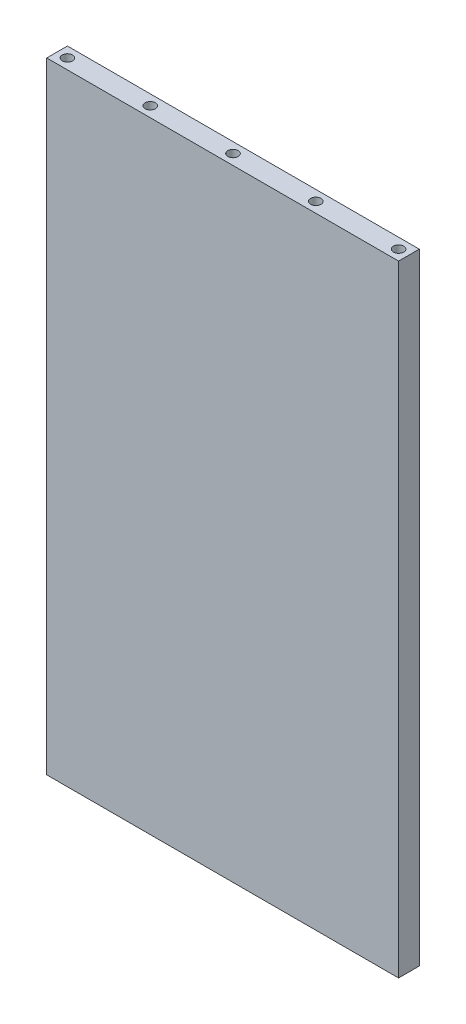
ISO-10303-21;
HEADER;
FILE_DESCRIPTION(('STEP AP214'),'2;1');
FILE_NAME('part.step','',(''),(''),'','','');
FILE_SCHEMA(('AUTOMOTIVE_DESIGN { 1 0 10303 214 1 1 1 1 }'));
ENDSEC;
DATA;
#1=APPLICATION_CONTEXT('core data for automotive mechanical design processes');
#2=APPLICATION_PROTOCOL_DEFINITION('international standard','automotive_design',2000,#1);
#3=PRODUCT_CONTEXT('',#1,'mechanical');
#4=PRODUCT('Part','Part','',(#3));
#5=PRODUCT_RELATED_PRODUCT_CATEGORY('part','',(#4));
#6=PRODUCT_DEFINITION_FORMATION('','',#4);
#7=PRODUCT_DEFINITION_CONTEXT('part definition',#1,'design');
#8=PRODUCT_DEFINITION('design','',#6,#7);
#9=PRODUCT_DEFINITION_SHAPE('','',#8);
#10=(LENGTH_UNIT() NAMED_UNIT(*) SI_UNIT(.MILLI.,.METRE.));
#11=(NAMED_UNIT(*) PLANE_ANGLE_UNIT() SI_UNIT($,.RADIAN.));
#12=(NAMED_UNIT(*) SI_UNIT($,.STERADIAN.) SOLID_ANGLE_UNIT());
#13=UNCERTAINTY_MEASURE_WITH_UNIT(LENGTH_MEASURE(1.E-05),#10,'distance_accuracy_value','');
#14=(GEOMETRIC_REPRESENTATION_CONTEXT(3) GLOBAL_UNCERTAINTY_ASSIGNED_CONTEXT((#13)) GLOBAL_UNIT_ASSIGNED_CONTEXT((#10,
#11,#12)) REPRESENTATION_CONTEXT('',''));
#15=CARTESIAN_POINT('',(0.,0.,0.));
#16=DIRECTION('',(0.,0.,1.));
#17=DIRECTION('',(1.,0.,0.));
#18=AXIS2_PLACEMENT_3D('',#15,#16,#17);
#19=CARTESIAN_POINT('',(-85.,150.,5.));
#20=DIRECTION('',(0.,-1.,0.));
#21=DIRECTION('',(0.,0.,-1.));
#22=AXIS2_PLACEMENT_3D('',#19,#20,#21);
#23=PLANE('',#22);
#24=CARTESIAN_POINT('',(-40.,150.,-8.37955521322352E-13));
#25=DIRECTION('',(0.,-1.,0.));
#26=DIRECTION('',(0.,0.,-1.));
#27=AXIS2_PLACEMENT_3D('',#24,#25,#26);
#28=CIRCLE('',#27,2.5);
#29=CARTESIAN_POINT('',(-40.,150.,-2.50000000000083));
#30=VERTEX_POINT('',#29);
#31=EDGE_CURVE('E161',#30,#30,#28,.T.);
#32=ORIENTED_EDGE('',*,*,#31,.T.);
#33=EDGE_LOOP('',(#32));
#34=FACE_BOUND('',#33,.T.);
#35=CARTESIAN_POINT('',(40.,150.,-2.79318507107451E-13));
#36=DIRECTION('',(0.,-1.,0.));
#37=DIRECTION('',(0.,0.,-1.));
#38=AXIS2_PLACEMENT_3D('',#35,#36,#37);
#39=CIRCLE('',#38,2.5);
#40=CARTESIAN_POINT('',(40.,150.,-2.50000000000027));
#41=VERTEX_POINT('',#40);
#42=EDGE_CURVE('E149',#41,#41,#39,.T.);
#43=ORIENTED_EDGE('',*,*,#42,.T.);
#44=EDGE_LOOP('',(#43));
#45=FACE_BOUND('',#44,.T.);
#46=DIRECTION('',(-1.,0.,0.));
#47=VECTOR('',#46,1.);
#48=CARTESIAN_POINT('',(-85.,150.,-5.));
#49=LINE('',#48,#47);
#50=CARTESIAN_POINT('',(85.,150.,-5.));
#51=VERTEX_POINT('',#50);
#52=CARTESIAN_POINT('',(-85.,150.,-5.));
#53=VERTEX_POINT('',#52);
#54=EDGE_CURVE('E91',#51,#53,#49,.T.);
#55=ORIENTED_EDGE('',*,*,#54,.T.);
#56=DIRECTION('',(0.,0.,-1.));
#57=VECTOR('',#56,1.);
#58=CARTESIAN_POINT('',(-85.,150.,5.));
#59=LINE('',#58,#57);
#60=CARTESIAN_POINT('',(-85.,150.,5.));
#61=VERTEX_POINT('',#60);
#62=EDGE_CURVE('E44',#61,#53,#59,.T.);
#63=ORIENTED_EDGE('',*,*,#62,.F.);
#64=DIRECTION('',(-1.,0.,0.));
#65=VECTOR('',#64,1.);
#66=CARTESIAN_POINT('',(-85.,150.,5.));
#67=LINE('',#66,#65);
#68=CARTESIAN_POINT('',(85.,150.,5.));
#69=VERTEX_POINT('',#68);
#70=EDGE_CURVE('E82',#69,#61,#67,.T.);
#71=ORIENTED_EDGE('',*,*,#70,.F.);
#72=DIRECTION('',(0.,0.,-1.));
#73=VECTOR('',#72,1.);
#74=CARTESIAN_POINT('',(85.,150.,5.));
#75=LINE('',#74,#73);
#76=EDGE_CURVE('E11',#69,#51,#75,.T.);
#77=ORIENTED_EDGE('',*,*,#76,.T.);
#78=EDGE_LOOP('',(#55,#63,#71,#77));
#79=FACE_BOUND('',#78,.T.);
#80=CARTESIAN_POINT('',(80.,150.,0.));
#81=DIRECTION('',(0.,-1.,0.));
#82=DIRECTION('',(0.,0.,-1.));
#83=AXIS2_PLACEMENT_3D('',#80,#81,#82);
#84=CIRCLE('',#83,2.5);
#85=CARTESIAN_POINT('',(80.,150.,-2.5));
#86=VERTEX_POINT('',#85);
#87=EDGE_CURVE('E143',#86,#86,#84,.T.);
#88=ORIENTED_EDGE('',*,*,#87,.T.);
#89=EDGE_LOOP('',(#88));
#90=FACE_BOUND('',#89,.T.);
#91=CARTESIAN_POINT('',(0.,150.,-5.58637014214901E-13));
#92=DIRECTION('',(0.,-1.,0.));
#93=DIRECTION('',(0.,0.,-1.));
#94=AXIS2_PLACEMENT_3D('',#91,#92,#93);
#95=CIRCLE('',#94,2.5);
#96=CARTESIAN_POINT('',(0.,150.,-2.50000000000055));
#97=VERTEX_POINT('',#96);
#98=EDGE_CURVE('E155',#97,#97,#95,.T.);
#99=ORIENTED_EDGE('',*,*,#98,.T.);
#100=EDGE_LOOP('',(#99));
#101=FACE_BOUND('',#100,.T.);
#102=CARTESIAN_POINT('',(-80.,150.,-1.1172740284298E-12));
#103=DIRECTION('',(0.,-1.,0.));
#104=DIRECTION('',(0.,0.,-1.));
#105=AXIS2_PLACEMENT_3D('',#102,#103,#104);
#106=CIRCLE('',#105,2.5);
#107=CARTESIAN_POINT('',(-80.,150.,-2.50000000000111));
#108=VERTEX_POINT('',#107);
#109=EDGE_CURVE('E167',#108,#108,#106,.T.);
#110=ORIENTED_EDGE('',*,*,#109,.T.);
#111=EDGE_LOOP('',(#110));
#112=FACE_BOUND('',#111,.T.);
#113=ADVANCED_FACE('F35',(#34,#45,#79,#90,#101,#112),#23,.F.);
#114=CARTESIAN_POINT('',(85.,-150.,5.));
#115=DIRECTION('',(-1.,0.,0.));
#116=DIRECTION('',(0.,0.,1.));
#117=AXIS2_PLACEMENT_3D('',#114,#115,#116);
#118=PLANE('',#117);
#119=DIRECTION('',(0.,1.,0.));
#120=VECTOR('',#119,1.);
#121=CARTESIAN_POINT('',(85.,-150.,-5.));
#122=LINE('',#121,#120);
#123=CARTESIAN_POINT('',(85.,-150.,-5.));
#124=VERTEX_POINT('',#123);
#125=EDGE_CURVE('E99',#124,#51,#122,.T.);
#126=ORIENTED_EDGE('',*,*,#125,.T.);
#127=ORIENTED_EDGE('',*,*,#76,.F.);
#128=DIRECTION('',(0.,1.,0.));
#129=VECTOR('',#128,1.);
#130=CARTESIAN_POINT('',(85.,-150.,5.));
#131=LINE('',#130,#129);
#132=CARTESIAN_POINT('',(85.,-150.,5.));
#133=VERTEX_POINT('',#132);
#134=EDGE_CURVE('E87',#133,#69,#131,.T.);
#135=ORIENTED_EDGE('',*,*,#134,.F.);
#136=DIRECTION('',(0.,0.,-1.));
#137=VECTOR('',#136,1.);
#138=CARTESIAN_POINT('',(85.,-150.,5.));
#139=LINE('',#138,#137);
#140=EDGE_CURVE('E95',#133,#124,#139,.T.);
#141=ORIENTED_EDGE('',*,*,#140,.T.);
#142=EDGE_LOOP('',(#126,#127,#135,#141));
#143=FACE_BOUND('',#142,.T.);
#144=ADVANCED_FACE('F37',(#143),#118,.F.);
#145=CARTESIAN_POINT('',(-85.,-150.,5.));
#146=DIRECTION('',(1.,0.,0.));
#147=DIRECTION('',(0.,0.,-1.));
#148=AXIS2_PLACEMENT_3D('',#145,#146,#147);
#149=PLANE('',#148);
#150=CARTESIAN_POINT('',(-85.,-77.5,0.));
#151=DIRECTION('',(-1.,0.,0.));
#152=DIRECTION('',(0.,0.,-1.));
#153=AXIS2_PLACEMENT_3D('',#150,#151,#152);
#154=CIRCLE('',#153,2.5);
#155=CARTESIAN_POINT('',(-85.,-77.5,-2.50000000000001));
#156=VERTEX_POINT('',#155);
#157=EDGE_CURVE('E185',#156,#156,#154,.T.);
#158=ORIENTED_EDGE('',*,*,#157,.F.);
#159=EDGE_LOOP('',(#158));
#160=FACE_BOUND('',#159,.T.);
#161=CARTESIAN_POINT('',(-85.,77.5,0.));
#162=DIRECTION('',(-1.,0.,0.));
#163=DIRECTION('',(0.,0.,1.));
#164=AXIS2_PLACEMENT_3D('',#161,#162,#163);
#165=CIRCLE('',#164,2.5);
#166=CARTESIAN_POINT('',(-85.,77.5,2.49999999999999));
#167=VERTEX_POINT('',#166);
#168=EDGE_CURVE('E179',#167,#167,#165,.T.);
#169=ORIENTED_EDGE('',*,*,#168,.F.);
#170=EDGE_LOOP('',(#169));
#171=FACE_BOUND('',#170,.T.);
#172=CARTESIAN_POINT('',(-85.,0.,0.));
#173=DIRECTION('',(-1.,0.,0.));
#174=DIRECTION('',(0.,0.,1.));
#175=AXIS2_PLACEMENT_3D('',#172,#173,#174);
#176=CIRCLE('',#175,2.5);
#177=CARTESIAN_POINT('',(-85.,0.,2.5));
#178=VERTEX_POINT('',#177);
#179=EDGE_CURVE('E173',#178,#178,#176,.T.);
#180=ORIENTED_EDGE('',*,*,#179,.F.);
#181=EDGE_LOOP('',(#180));
#182=FACE_BOUND('',#181,.T.);
#183=DIRECTION('',(0.,-1.,0.));
#184=VECTOR('',#183,1.);
#185=CARTESIAN_POINT('',(-85.,-150.,-5.));
#186=LINE('',#185,#184);
#187=CARTESIAN_POINT('',(-85.,-150.,-5.));
#188=VERTEX_POINT('',#187);
#189=EDGE_CURVE('E69',#53,#188,#186,.T.);
#190=ORIENTED_EDGE('',*,*,#189,.T.);
#191=DIRECTION('',(0.,0.,-1.));
#192=VECTOR('',#191,1.);
#193=CARTESIAN_POINT('',(-85.,-150.,5.));
#194=LINE('',#193,#192);
#195=CARTESIAN_POINT('',(-85.,-150.,5.));
#196=VERTEX_POINT('',#195);
#197=EDGE_CURVE('E92',#196,#188,#194,.T.);
#198=ORIENTED_EDGE('',*,*,#197,.F.);
#199=DIRECTION('',(0.,-1.,0.));
#200=VECTOR('',#199,1.);
#201=CARTESIAN_POINT('',(-85.,-150.,5.));
#202=LINE('',#201,#200);
#203=EDGE_CURVE('E85',#61,#196,#202,.T.);
#204=ORIENTED_EDGE('',*,*,#203,.F.);
#205=ORIENTED_EDGE('',*,*,#62,.T.);
#206=EDGE_LOOP('',(#190,#198,#204,#205));
#207=FACE_BOUND('',#206,.T.);
#208=ADVANCED_FACE('F93',(#160,#171,#182,#207),#149,.F.);
#209=CARTESIAN_POINT('',(-85.,-150.,5.));
#210=DIRECTION('',(0.,1.,0.));
#211=DIRECTION('',(0.,0.,1.));
#212=AXIS2_PLACEMENT_3D('',#209,#210,#211);
#213=PLANE('',#212);
#214=CARTESIAN_POINT('',(-80.,-150.,-1.1172740284298E-12));
#215=DIRECTION('',(0.,-1.,0.));
#216=DIRECTION('',(0.,0.,-1.));
#217=AXIS2_PLACEMENT_3D('',#214,#215,#216);
#218=CIRCLE('',#217,2.5);
#219=CARTESIAN_POINT('',(-80.,-150.,-2.50000000000111));
#220=VERTEX_POINT('',#219);
#221=EDGE_CURVE('E137',#220,#220,#218,.T.);
#222=ORIENTED_EDGE('',*,*,#221,.F.);
#223=EDGE_LOOP('',(#222));
#224=FACE_BOUND('',#223,.T.);
#225=CARTESIAN_POINT('',(-40.,-150.,-8.37955521322352E-13));
#226=DIRECTION('',(0.,-1.,0.));
#227=DIRECTION('',(0.,0.,-1.));
#228=AXIS2_PLACEMENT_3D('',#225,#226,#227);
#229=CIRCLE('',#228,2.5);
#230=CARTESIAN_POINT('',(-40.,-150.,-2.50000000000083));
#231=VERTEX_POINT('',#230);
#232=EDGE_CURVE('E131',#231,#231,#229,.T.);
#233=ORIENTED_EDGE('',*,*,#232,.F.);
#234=EDGE_LOOP('',(#233));
#235=FACE_BOUND('',#234,.T.);
#236=CARTESIAN_POINT('',(0.,-150.,-5.58637014214901E-13));
#237=DIRECTION('',(0.,-1.,0.));
#238=DIRECTION('',(0.,0.,-1.));
#239=AXIS2_PLACEMENT_3D('',#236,#237,#238);
#240=CIRCLE('',#239,2.5);
#241=CARTESIAN_POINT('',(0.,-150.,-2.50000000000055));
#242=VERTEX_POINT('',#241);
#243=EDGE_CURVE('E125',#242,#242,#240,.T.);
#244=ORIENTED_EDGE('',*,*,#243,.F.);
#245=EDGE_LOOP('',(#244));
#246=FACE_BOUND('',#245,.T.);
#247=CARTESIAN_POINT('',(40.,-150.,-2.79318507107451E-13));
#248=DIRECTION('',(0.,-1.,0.));
#249=DIRECTION('',(0.,0.,-1.));
#250=AXIS2_PLACEMENT_3D('',#247,#248,#249);
#251=CIRCLE('',#250,2.5);
#252=CARTESIAN_POINT('',(40.,-150.,-2.50000000000027));
#253=VERTEX_POINT('',#252);
#254=EDGE_CURVE('E119',#253,#253,#251,.T.);
#255=ORIENTED_EDGE('',*,*,#254,.F.);
#256=EDGE_LOOP('',(#255));
#257=FACE_BOUND('',#256,.T.);
#258=CARTESIAN_POINT('',(80.,-150.,0.));
#259=DIRECTION('',(0.,-1.,0.));
#260=DIRECTION('',(0.,0.,-1.));
#261=AXIS2_PLACEMENT_3D('',#258,#259,#260);
#262=CIRCLE('',#261,2.5);
#263=CARTESIAN_POINT('',(80.,-150.,-2.5));
#264=VERTEX_POINT('',#263);
#265=EDGE_CURVE('E113',#264,#264,#262,.T.);
#266=ORIENTED_EDGE('',*,*,#265,.F.);
#267=EDGE_LOOP('',(#266));
#268=FACE_BOUND('',#267,.T.);
#269=DIRECTION('',(1.,0.,0.));
#270=VECTOR('',#269,1.);
#271=CARTESIAN_POINT('',(-85.,-150.,-5.));
#272=LINE('',#271,#270);
#273=EDGE_CURVE('E75',#188,#124,#272,.T.);
#274=ORIENTED_EDGE('',*,*,#273,.T.);
#275=ORIENTED_EDGE('',*,*,#140,.F.);
#276=DIRECTION('',(1.,0.,0.));
#277=VECTOR('',#276,1.);
#278=CARTESIAN_POINT('',(-85.,-150.,5.));
#279=LINE('',#278,#277);
#280=EDGE_CURVE('E52',#196,#133,#279,.T.);
#281=ORIENTED_EDGE('',*,*,#280,.F.);
#282=ORIENTED_EDGE('',*,*,#197,.T.);
#283=EDGE_LOOP('',(#274,#275,#281,#282));
#284=FACE_BOUND('',#283,.T.);
#285=ADVANCED_FACE('F107',(#224,#235,#246,#257,#268,#284),#213,.F.);
#286=CARTESIAN_POINT('',(0.,0.,5.));
#287=DIRECTION('',(0.,0.,-1.));
#288=DIRECTION('',(-1.,0.,0.));
#289=AXIS2_PLACEMENT_3D('',#286,#287,#288);
#290=PLANE('',#289);
#291=ORIENTED_EDGE('',*,*,#134,.T.);
#292=ORIENTED_EDGE('',*,*,#70,.T.);
#293=ORIENTED_EDGE('',*,*,#203,.T.);
#294=ORIENTED_EDGE('',*,*,#280,.T.);
#295=EDGE_LOOP('',(#291,#292,#293,#294));
#296=FACE_BOUND('',#295,.T.);
#297=ADVANCED_FACE('F83',(#296),#290,.F.);
#298=CARTESIAN_POINT('',(0.,0.,-5.));
#299=DIRECTION('',(0.,0.,-1.));
#300=DIRECTION('',(-1.,0.,0.));
#301=AXIS2_PLACEMENT_3D('',#298,#299,#300);
#302=PLANE('',#301);
#303=ORIENTED_EDGE('',*,*,#125,.F.);
#304=ORIENTED_EDGE('',*,*,#273,.F.);
#305=ORIENTED_EDGE('',*,*,#189,.F.);
#306=ORIENTED_EDGE('',*,*,#54,.F.);
#307=EDGE_LOOP('',(#303,#304,#305,#306));
#308=FACE_BOUND('',#307,.T.);
#309=ADVANCED_FACE('F110',(#308),#302,.T.);
#310=CARTESIAN_POINT('',(80.,-145.,0.));
#311=DIRECTION('',(0.,-1.,0.));
#312=DIRECTION('',(0.,0.,-1.));
#313=AXIS2_PLACEMENT_3D('',#310,#311,#312);
#314=CYLINDRICAL_SURFACE('',#313,2.5);
#315=CARTESIAN_POINT('',(80.,-145.,0.));
#316=DIRECTION('',(0.,-1.,0.));
#317=DIRECTION('',(0.,0.,-1.));
#318=AXIS2_PLACEMENT_3D('',#315,#316,#317);
#319=CIRCLE('',#318,2.5);
#320=CARTESIAN_POINT('',(80.,-145.,-2.5));
#321=VERTEX_POINT('',#320);
#322=EDGE_CURVE('E102',#321,#321,#319,.T.);
#323=ORIENTED_EDGE('',*,*,#322,.F.);
#324=EDGE_LOOP('',(#323));
#325=FACE_BOUND('',#324,.T.);
#326=ORIENTED_EDGE('',*,*,#265,.T.);
#327=EDGE_LOOP('',(#326));
#328=FACE_BOUND('',#327,.T.);
#329=ADVANCED_FACE('F236',(#325,#328),#314,.F.);
#330=CARTESIAN_POINT('',(80.,-145.,0.));
#331=DIRECTION('',(0.,-1.,0.));
#332=DIRECTION('',(0.,0.,-1.));
#333=AXIS2_PLACEMENT_3D('',#330,#331,#332);
#334=PLANE('',#333);
#335=ORIENTED_EDGE('',*,*,#322,.T.);
#336=EDGE_LOOP('',(#335));
#337=FACE_BOUND('',#336,.T.);
#338=ADVANCED_FACE('F241',(#337),#334,.T.);
#339=CARTESIAN_POINT('',(40.,-145.,-2.79318507107451E-13));
#340=DIRECTION('',(0.,-1.,0.));
#341=DIRECTION('',(0.,0.,-1.));
#342=AXIS2_PLACEMENT_3D('',#339,#340,#341);
#343=CYLINDRICAL_SURFACE('',#342,2.5);
#344=CARTESIAN_POINT('',(40.,-145.,-2.79318507107451E-13));
#345=DIRECTION('',(0.,-1.,0.));
#346=DIRECTION('',(0.,0.,-1.));
#347=AXIS2_PLACEMENT_3D('',#344,#345,#346);
#348=CIRCLE('',#347,2.5);
#349=CARTESIAN_POINT('',(40.,-145.,-2.50000000000027));
#350=VERTEX_POINT('',#349);
#351=EDGE_CURVE('E116',#350,#350,#348,.T.);
#352=ORIENTED_EDGE('',*,*,#351,.F.);
#353=EDGE_LOOP('',(#352));
#354=FACE_BOUND('',#353,.T.);
#355=ORIENTED_EDGE('',*,*,#254,.T.);
#356=EDGE_LOOP('',(#355));
#357=FACE_BOUND('',#356,.T.);
#358=ADVANCED_FACE('F245',(#354,#357),#343,.F.);
#359=CARTESIAN_POINT('',(40.,-145.,-2.79318507107451E-13));
#360=DIRECTION('',(0.,-1.,0.));
#361=DIRECTION('',(0.,0.,-1.));
#362=AXIS2_PLACEMENT_3D('',#359,#360,#361);
#363=PLANE('',#362);
#364=ORIENTED_EDGE('',*,*,#351,.T.);
#365=EDGE_LOOP('',(#364));
#366=FACE_BOUND('',#365,.T.);
#367=ADVANCED_FACE('F249',(#366),#363,.T.);
#368=CARTESIAN_POINT('',(0.,-145.,-5.58637014214901E-13));
#369=DIRECTION('',(0.,-1.,0.));
#370=DIRECTION('',(0.,0.,-1.));
#371=AXIS2_PLACEMENT_3D('',#368,#369,#370);
#372=CYLINDRICAL_SURFACE('',#371,2.5);
#373=CARTESIAN_POINT('',(0.,-145.,-5.58637014214901E-13));
#374=DIRECTION('',(0.,-1.,0.));
#375=DIRECTION('',(0.,0.,-1.));
#376=AXIS2_PLACEMENT_3D('',#373,#374,#375);
#377=CIRCLE('',#376,2.5);
#378=CARTESIAN_POINT('',(0.,-145.,-2.50000000000055));
#379=VERTEX_POINT('',#378);
#380=EDGE_CURVE('E122',#379,#379,#377,.T.);
#381=ORIENTED_EDGE('',*,*,#380,.F.);
#382=EDGE_LOOP('',(#381));
#383=FACE_BOUND('',#382,.T.);
#384=ORIENTED_EDGE('',*,*,#243,.T.);
#385=EDGE_LOOP('',(#384));
#386=FACE_BOUND('',#385,.T.);
#387=ADVANCED_FACE('F253',(#383,#386),#372,.F.);
#388=CARTESIAN_POINT('',(0.,-145.,-5.58637014214901E-13));
#389=DIRECTION('',(0.,-1.,0.));
#390=DIRECTION('',(0.,0.,-1.));
#391=AXIS2_PLACEMENT_3D('',#388,#389,#390);
#392=PLANE('',#391);
#393=ORIENTED_EDGE('',*,*,#380,.T.);
#394=EDGE_LOOP('',(#393));
#395=FACE_BOUND('',#394,.T.);
#396=ADVANCED_FACE('F257',(#395),#392,.T.);
#397=CARTESIAN_POINT('',(-40.,-145.,-8.37955521322352E-13));
#398=DIRECTION('',(0.,-1.,0.));
#399=DIRECTION('',(0.,0.,-1.));
#400=AXIS2_PLACEMENT_3D('',#397,#398,#399);
#401=CYLINDRICAL_SURFACE('',#400,2.5);
#402=CARTESIAN_POINT('',(-40.,-145.,-8.37955521322352E-13));
#403=DIRECTION('',(0.,-1.,0.));
#404=DIRECTION('',(0.,0.,-1.));
#405=AXIS2_PLACEMENT_3D('',#402,#403,#404);
#406=CIRCLE('',#405,2.5);
#407=CARTESIAN_POINT('',(-40.,-145.,-2.50000000000083));
#408=VERTEX_POINT('',#407);
#409=EDGE_CURVE('E128',#408,#408,#406,.T.);
#410=ORIENTED_EDGE('',*,*,#409,.F.);
#411=EDGE_LOOP('',(#410));
#412=FACE_BOUND('',#411,.T.);
#413=ORIENTED_EDGE('',*,*,#232,.T.);
#414=EDGE_LOOP('',(#413));
#415=FACE_BOUND('',#414,.T.);
#416=ADVANCED_FACE('F261',(#412,#415),#401,.F.);
#417=CARTESIAN_POINT('',(-40.,-145.,-8.37955521322352E-13));
#418=DIRECTION('',(0.,-1.,0.));
#419=DIRECTION('',(0.,0.,-1.));
#420=AXIS2_PLACEMENT_3D('',#417,#418,#419);
#421=PLANE('',#420);
#422=ORIENTED_EDGE('',*,*,#409,.T.);
#423=EDGE_LOOP('',(#422));
#424=FACE_BOUND('',#423,.T.);
#425=ADVANCED_FACE('F265',(#424),#421,.T.);
#426=CARTESIAN_POINT('',(-80.,-145.,-1.1172740284298E-12));
#427=DIRECTION('',(0.,-1.,0.));
#428=DIRECTION('',(0.,0.,-1.));
#429=AXIS2_PLACEMENT_3D('',#426,#427,#428);
#430=CYLINDRICAL_SURFACE('',#429,2.5);
#431=CARTESIAN_POINT('',(-80.,-145.,-1.1172740284298E-12));
#432=DIRECTION('',(0.,-1.,0.));
#433=DIRECTION('',(0.,0.,-1.));
#434=AXIS2_PLACEMENT_3D('',#431,#432,#433);
#435=CIRCLE('',#434,2.5);
#436=CARTESIAN_POINT('',(-80.,-145.,-2.50000000000111));
#437=VERTEX_POINT('',#436);
#438=EDGE_CURVE('E134',#437,#437,#435,.T.);
#439=ORIENTED_EDGE('',*,*,#438,.F.);
#440=EDGE_LOOP('',(#439));
#441=FACE_BOUND('',#440,.T.);
#442=ORIENTED_EDGE('',*,*,#221,.T.);
#443=EDGE_LOOP('',(#442));
#444=FACE_BOUND('',#443,.T.);
#445=ADVANCED_FACE('F269',(#441,#444),#430,.F.);
#446=CARTESIAN_POINT('',(-80.,-145.,-1.1172740284298E-12));
#447=DIRECTION('',(0.,-1.,0.));
#448=DIRECTION('',(0.,0.,-1.));
#449=AXIS2_PLACEMENT_3D('',#446,#447,#448);
#450=PLANE('',#449);
#451=ORIENTED_EDGE('',*,*,#438,.T.);
#452=EDGE_LOOP('',(#451));
#453=FACE_BOUND('',#452,.T.);
#454=ADVANCED_FACE('F273',(#453),#450,.T.);
#455=CARTESIAN_POINT('',(80.,145.,0.));
#456=DIRECTION('',(0.,1.,0.));
#457=DIRECTION('',(0.,0.,1.));
#458=AXIS2_PLACEMENT_3D('',#455,#456,#457);
#459=CYLINDRICAL_SURFACE('',#458,2.5);
#460=CARTESIAN_POINT('',(80.,145.,0.));
#461=DIRECTION('',(0.,-1.,0.));
#462=DIRECTION('',(0.,0.,-1.));
#463=AXIS2_PLACEMENT_3D('',#460,#461,#462);
#464=CIRCLE('',#463,2.5);
#465=CARTESIAN_POINT('',(80.,145.,-2.5));
#466=VERTEX_POINT('',#465);
#467=EDGE_CURVE('E140',#466,#466,#464,.T.);
#468=ORIENTED_EDGE('',*,*,#467,.T.);
#469=EDGE_LOOP('',(#468));
#470=FACE_BOUND('',#469,.T.);
#471=ORIENTED_EDGE('',*,*,#87,.F.);
#472=EDGE_LOOP('',(#471));
#473=FACE_BOUND('',#472,.T.);
#474=ADVANCED_FACE('F277',(#470,#473),#459,.F.);
#475=CARTESIAN_POINT('',(80.,145.,0.));
#476=DIRECTION('',(0.,1.,0.));
#477=DIRECTION('',(0.,0.,-1.));
#478=AXIS2_PLACEMENT_3D('',#475,#476,#477);
#479=PLANE('',#478);
#480=ORIENTED_EDGE('',*,*,#467,.F.);
#481=EDGE_LOOP('',(#480));
#482=FACE_BOUND('',#481,.T.);
#483=ADVANCED_FACE('F281',(#482),#479,.T.);
#484=CARTESIAN_POINT('',(40.,145.,-2.79318507107451E-13));
#485=DIRECTION('',(0.,1.,0.));
#486=DIRECTION('',(0.,0.,1.));
#487=AXIS2_PLACEMENT_3D('',#484,#485,#486);
#488=CYLINDRICAL_SURFACE('',#487,2.5);
#489=CARTESIAN_POINT('',(40.,145.,-2.79318507107451E-13));
#490=DIRECTION('',(0.,-1.,0.));
#491=DIRECTION('',(0.,0.,-1.));
#492=AXIS2_PLACEMENT_3D('',#489,#490,#491);
#493=CIRCLE('',#492,2.5);
#494=CARTESIAN_POINT('',(40.,145.,-2.50000000000027));
#495=VERTEX_POINT('',#494);
#496=EDGE_CURVE('E146',#495,#495,#493,.T.);
#497=ORIENTED_EDGE('',*,*,#496,.T.);
#498=EDGE_LOOP('',(#497));
#499=FACE_BOUND('',#498,.T.);
#500=ORIENTED_EDGE('',*,*,#42,.F.);
#501=EDGE_LOOP('',(#500));
#502=FACE_BOUND('',#501,.T.);
#503=ADVANCED_FACE('F285',(#499,#502),#488,.F.);
#504=CARTESIAN_POINT('',(40.,145.,-2.79318507107451E-13));
#505=DIRECTION('',(0.,1.,0.));
#506=DIRECTION('',(0.,0.,-1.));
#507=AXIS2_PLACEMENT_3D('',#504,#505,#506);
#508=PLANE('',#507);
#509=ORIENTED_EDGE('',*,*,#496,.F.);
#510=EDGE_LOOP('',(#509));
#511=FACE_BOUND('',#510,.T.);
#512=ADVANCED_FACE('F289',(#511),#508,.T.);
#513=CARTESIAN_POINT('',(0.,145.,-5.58637014214901E-13));
#514=DIRECTION('',(0.,1.,0.));
#515=DIRECTION('',(0.,0.,1.));
#516=AXIS2_PLACEMENT_3D('',#513,#514,#515);
#517=CYLINDRICAL_SURFACE('',#516,2.5);
#518=CARTESIAN_POINT('',(0.,145.,-5.58637014214901E-13));
#519=DIRECTION('',(0.,-1.,0.));
#520=DIRECTION('',(0.,0.,-1.));
#521=AXIS2_PLACEMENT_3D('',#518,#519,#520);
#522=CIRCLE('',#521,2.5);
#523=CARTESIAN_POINT('',(0.,145.,-2.50000000000055));
#524=VERTEX_POINT('',#523);
#525=EDGE_CURVE('E152',#524,#524,#522,.T.);
#526=ORIENTED_EDGE('',*,*,#525,.T.);
#527=EDGE_LOOP('',(#526));
#528=FACE_BOUND('',#527,.T.);
#529=ORIENTED_EDGE('',*,*,#98,.F.);
#530=EDGE_LOOP('',(#529));
#531=FACE_BOUND('',#530,.T.);
#532=ADVANCED_FACE('F293',(#528,#531),#517,.F.);
#533=CARTESIAN_POINT('',(0.,145.,-5.58637014214901E-13));
#534=DIRECTION('',(0.,1.,0.));
#535=DIRECTION('',(0.,0.,-1.));
#536=AXIS2_PLACEMENT_3D('',#533,#534,#535);
#537=PLANE('',#536);
#538=ORIENTED_EDGE('',*,*,#525,.F.);
#539=EDGE_LOOP('',(#538));
#540=FACE_BOUND('',#539,.T.);
#541=ADVANCED_FACE('F297',(#540),#537,.T.);
#542=CARTESIAN_POINT('',(-40.,145.,-8.37955521322352E-13));
#543=DIRECTION('',(0.,1.,0.));
#544=DIRECTION('',(0.,0.,1.));
#545=AXIS2_PLACEMENT_3D('',#542,#543,#544);
#546=CYLINDRICAL_SURFACE('',#545,2.5);
#547=CARTESIAN_POINT('',(-40.,145.,-8.37955521322352E-13));
#548=DIRECTION('',(0.,-1.,0.));
#549=DIRECTION('',(0.,0.,-1.));
#550=AXIS2_PLACEMENT_3D('',#547,#548,#549);
#551=CIRCLE('',#550,2.5);
#552=CARTESIAN_POINT('',(-40.,145.,-2.50000000000083));
#553=VERTEX_POINT('',#552);
#554=EDGE_CURVE('E158',#553,#553,#551,.T.);
#555=ORIENTED_EDGE('',*,*,#554,.T.);
#556=EDGE_LOOP('',(#555));
#557=FACE_BOUND('',#556,.T.);
#558=ORIENTED_EDGE('',*,*,#31,.F.);
#559=EDGE_LOOP('',(#558));
#560=FACE_BOUND('',#559,.T.);
#561=ADVANCED_FACE('F301',(#557,#560),#546,.F.);
#562=CARTESIAN_POINT('',(-40.,145.,-8.37955521322352E-13));
#563=DIRECTION('',(0.,1.,0.));
#564=DIRECTION('',(0.,0.,-1.));
#565=AXIS2_PLACEMENT_3D('',#562,#563,#564);
#566=PLANE('',#565);
#567=ORIENTED_EDGE('',*,*,#554,.F.);
#568=EDGE_LOOP('',(#567));
#569=FACE_BOUND('',#568,.T.);
#570=ADVANCED_FACE('F305',(#569),#566,.T.);
#571=CARTESIAN_POINT('',(-80.,145.,-1.1172740284298E-12));
#572=DIRECTION('',(0.,1.,0.));
#573=DIRECTION('',(0.,0.,1.));
#574=AXIS2_PLACEMENT_3D('',#571,#572,#573);
#575=CYLINDRICAL_SURFACE('',#574,2.5);
#576=CARTESIAN_POINT('',(-80.,145.,-1.1172740284298E-12));
#577=DIRECTION('',(0.,-1.,0.));
#578=DIRECTION('',(0.,0.,-1.));
#579=AXIS2_PLACEMENT_3D('',#576,#577,#578);
#580=CIRCLE('',#579,2.5);
#581=CARTESIAN_POINT('',(-80.,145.,-2.50000000000111));
#582=VERTEX_POINT('',#581);
#583=EDGE_CURVE('E164',#582,#582,#580,.T.);
#584=ORIENTED_EDGE('',*,*,#583,.T.);
#585=EDGE_LOOP('',(#584));
#586=FACE_BOUND('',#585,.T.);
#587=ORIENTED_EDGE('',*,*,#109,.F.);
#588=EDGE_LOOP('',(#587));
#589=FACE_BOUND('',#588,.T.);
#590=ADVANCED_FACE('F220',(#586,#589),#575,.F.);
#591=CARTESIAN_POINT('',(-80.,145.,-1.1172740284298E-12));
#592=DIRECTION('',(0.,1.,0.));
#593=DIRECTION('',(0.,0.,-1.));
#594=AXIS2_PLACEMENT_3D('',#591,#592,#593);
#595=PLANE('',#594);
#596=ORIENTED_EDGE('',*,*,#583,.F.);
#597=EDGE_LOOP('',(#596));
#598=FACE_BOUND('',#597,.T.);
#599=ADVANCED_FACE('F210',(#598),#595,.T.);
#600=CARTESIAN_POINT('',(-80.,0.,0.));
#601=DIRECTION('',(-1.,0.,0.));
#602=DIRECTION('',(0.,0.,1.));
#603=AXIS2_PLACEMENT_3D('',#600,#601,#602);
#604=CYLINDRICAL_SURFACE('',#603,2.5);
#605=CARTESIAN_POINT('',(-80.,0.,0.));
#606=DIRECTION('',(-1.,0.,0.));
#607=DIRECTION('',(0.,0.,1.));
#608=AXIS2_PLACEMENT_3D('',#605,#606,#607);
#609=CIRCLE('',#608,2.5);
#610=CARTESIAN_POINT('',(-80.,0.,2.5));
#611=VERTEX_POINT('',#610);
#612=EDGE_CURVE('E170',#611,#611,#609,.T.);
#613=ORIENTED_EDGE('',*,*,#612,.F.);
#614=EDGE_LOOP('',(#613));
#615=FACE_BOUND('',#614,.T.);
#616=ORIENTED_EDGE('',*,*,#179,.T.);
#617=EDGE_LOOP('',(#616));
#618=FACE_BOUND('',#617,.T.);
#619=ADVANCED_FACE('F207',(#615,#618),#604,.F.);
#620=CARTESIAN_POINT('',(-80.,0.,0.));
#621=DIRECTION('',(-1.,0.,0.));
#622=DIRECTION('',(0.,0.,1.));
#623=AXIS2_PLACEMENT_3D('',#620,#621,#622);
#624=PLANE('',#623);
#625=ORIENTED_EDGE('',*,*,#612,.T.);
#626=EDGE_LOOP('',(#625));
#627=FACE_BOUND('',#626,.T.);
#628=ADVANCED_FACE('F209',(#627),#624,.T.);
#629=CARTESIAN_POINT('',(-80.,77.5,0.));
#630=DIRECTION('',(-1.,0.,0.));
#631=DIRECTION('',(0.,0.,1.));
#632=AXIS2_PLACEMENT_3D('',#629,#630,#631);
#633=CYLINDRICAL_SURFACE('',#632,2.5);
#634=CARTESIAN_POINT('',(-80.,77.5,0.));
#635=DIRECTION('',(-1.,0.,0.));
#636=DIRECTION('',(0.,0.,1.));
#637=AXIS2_PLACEMENT_3D('',#634,#635,#636);
#638=CIRCLE('',#637,2.5);
#639=CARTESIAN_POINT('',(-80.,77.5,2.49999999999999));
#640=VERTEX_POINT('',#639);
#641=EDGE_CURVE('E176',#640,#640,#638,.T.);
#642=ORIENTED_EDGE('',*,*,#641,.F.);
#643=EDGE_LOOP('',(#642));
#644=FACE_BOUND('',#643,.T.);
#645=ORIENTED_EDGE('',*,*,#168,.T.);
#646=EDGE_LOOP('',(#645));
#647=FACE_BOUND('',#646,.T.);
#648=ADVANCED_FACE('F217',(#644,#647),#633,.F.);
#649=CARTESIAN_POINT('',(-80.,77.5,0.));
#650=DIRECTION('',(-1.,0.,0.));
#651=DIRECTION('',(0.,0.,1.));
#652=AXIS2_PLACEMENT_3D('',#649,#650,#651);
#653=PLANE('',#652);
#654=ORIENTED_EDGE('',*,*,#641,.T.);
#655=EDGE_LOOP('',(#654));
#656=FACE_BOUND('',#655,.T.);
#657=ADVANCED_FACE('F196',(#656),#653,.T.);
#658=CARTESIAN_POINT('',(-80.,-77.5,0.));
#659=DIRECTION('',(-1.,0.,0.));
#660=DIRECTION('',(0.,0.,1.));
#661=AXIS2_PLACEMENT_3D('',#658,#659,#660);
#662=CYLINDRICAL_SURFACE('',#661,2.5);
#663=CARTESIAN_POINT('',(-80.,-77.5,0.));
#664=DIRECTION('',(-1.,0.,0.));
#665=DIRECTION('',(0.,0.,-1.));
#666=AXIS2_PLACEMENT_3D('',#663,#664,#665);
#667=CIRCLE('',#666,2.5);
#668=CARTESIAN_POINT('',(-80.,-77.5,-2.50000000000001));
#669=VERTEX_POINT('',#668);
#670=EDGE_CURVE('E182',#669,#669,#667,.T.);
#671=ORIENTED_EDGE('',*,*,#670,.F.);
#672=EDGE_LOOP('',(#671));
#673=FACE_BOUND('',#672,.T.);
#674=ORIENTED_EDGE('',*,*,#157,.T.);
#675=EDGE_LOOP('',(#674));
#676=FACE_BOUND('',#675,.T.);
#677=ADVANCED_FACE('F193',(#673,#676),#662,.F.);
#678=CARTESIAN_POINT('',(-80.,-77.5,0.));
#679=DIRECTION('',(1.,0.,0.));
#680=DIRECTION('',(0.,0.,-1.));
#681=AXIS2_PLACEMENT_3D('',#678,#679,#680);
#682=PLANE('',#681);
#683=ORIENTED_EDGE('',*,*,#670,.T.);
#684=EDGE_LOOP('',(#683));
#685=FACE_BOUND('',#684,.T.);
#686=ADVANCED_FACE('F191',(#685),#682,.F.);
#687=CLOSED_SHELL('',(#113,#144,#208,#285,#297,#309,#329,#338,#358,#367,#387,#396,#416,#425,
#445,#454,#474,#483,#503,#512,#532,#541,#561,#570,#590,#599,#619,#628,#648,#657,#677,#686));
#688=MANIFOLD_SOLID_BREP('B2',#687);
#689=ADVANCED_BREP_SHAPE_REPRESENTATION('',(#18,#688),#14);
#690=SHAPE_DEFINITION_REPRESENTATION(#9,#689);
ENDSEC;
END-ISO-10303-21;
